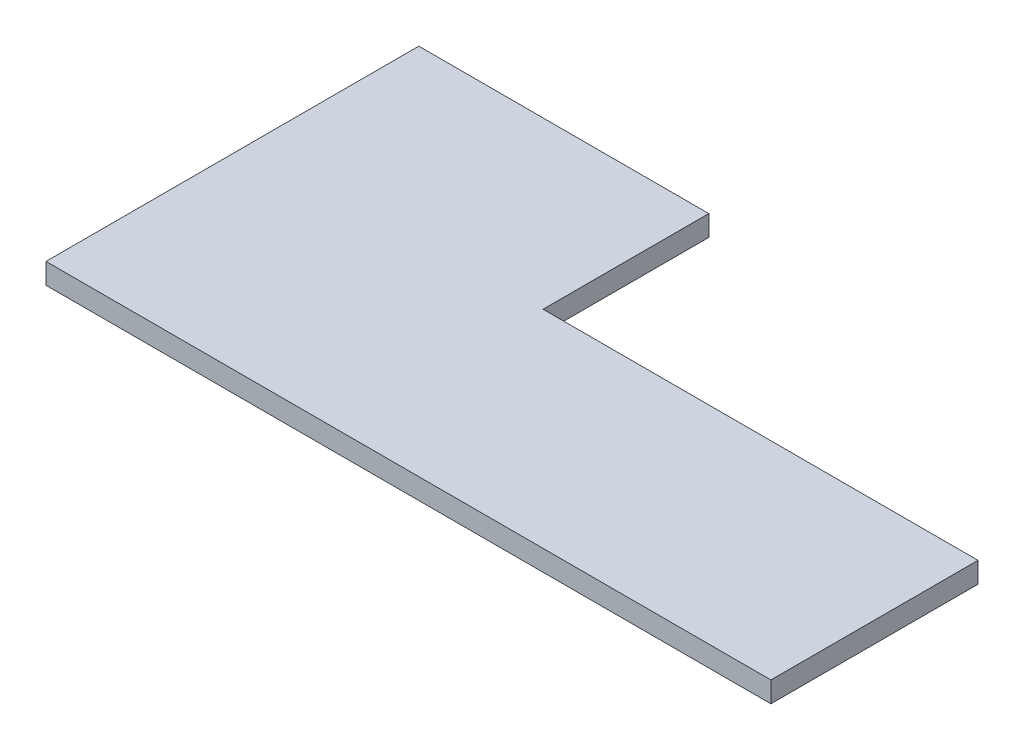
ISO-10303-21;
HEADER;
FILE_DESCRIPTION(('STEP AP214'),'2;1');
FILE_NAME('part.step','',(''),(''),'','','');
FILE_SCHEMA(('AUTOMOTIVE_DESIGN { 1 0 10303 214 1 1 1 1 }'));
ENDSEC;
DATA;
#1=APPLICATION_CONTEXT('core data for automotive mechanical design processes');
#2=APPLICATION_PROTOCOL_DEFINITION('international standard','automotive_design',2000,#1);
#3=PRODUCT_CONTEXT('',#1,'mechanical');
#4=PRODUCT('Part','Part','',(#3));
#5=PRODUCT_RELATED_PRODUCT_CATEGORY('part','',(#4));
#6=PRODUCT_DEFINITION_FORMATION('','',#4);
#7=PRODUCT_DEFINITION_CONTEXT('part definition',#1,'design');
#8=PRODUCT_DEFINITION('design','',#6,#7);
#9=PRODUCT_DEFINITION_SHAPE('','',#8);
#10=(LENGTH_UNIT() NAMED_UNIT(*) SI_UNIT(.MILLI.,.METRE.));
#11=(NAMED_UNIT(*) PLANE_ANGLE_UNIT() SI_UNIT($,.RADIAN.));
#12=(NAMED_UNIT(*) SI_UNIT($,.STERADIAN.) SOLID_ANGLE_UNIT());
#13=UNCERTAINTY_MEASURE_WITH_UNIT(LENGTH_MEASURE(1.E-05),#10,'distance_accuracy_value','');
#14=(GEOMETRIC_REPRESENTATION_CONTEXT(3) GLOBAL_UNCERTAINTY_ASSIGNED_CONTEXT((#13)) GLOBAL_UNIT_ASSIGNED_CONTEXT((#10,
#11,#12)) REPRESENTATION_CONTEXT('',''));
#15=CARTESIAN_POINT('',(0.,0.,0.));
#16=DIRECTION('',(0.,0.,1.));
#17=DIRECTION('',(1.,0.,0.));
#18=AXIS2_PLACEMENT_3D('',#15,#16,#17);
#19=CARTESIAN_POINT('',(14.,1.,0.));
#20=DIRECTION('',(1.,0.,0.));
#21=DIRECTION('',(0.,0.,-1.));
#22=AXIS2_PLACEMENT_3D('',#19,#20,#21);
#23=PLANE('',#22);
#24=DIRECTION('',(0.,0.,1.));
#25=VECTOR('',#24,1.);
#26=CARTESIAN_POINT('',(14.,0.,0.));
#27=LINE('',#26,#25);
#28=CARTESIAN_POINT('',(14.,0.,-18.));
#29=VERTEX_POINT('',#28);
#30=CARTESIAN_POINT('',(14.,0.,-10.));
#31=VERTEX_POINT('',#30);
#32=EDGE_CURVE('E125',#29,#31,#27,.T.);
#33=ORIENTED_EDGE('',*,*,#32,.F.);
#34=DIRECTION('',(0.,-1.,0.));
#35=VECTOR('',#34,1.);
#36=CARTESIAN_POINT('',(14.,1.,-18.));
#37=LINE('',#36,#35);
#38=CARTESIAN_POINT('',(14.,1.,-18.));
#39=VERTEX_POINT('',#38);
#40=EDGE_CURVE('E11',#39,#29,#37,.T.);
#41=ORIENTED_EDGE('',*,*,#40,.F.);
#42=DIRECTION('',(0.,0.,1.));
#43=VECTOR('',#42,1.);
#44=CARTESIAN_POINT('',(14.,1.,0.));
#45=LINE('',#44,#43);
#46=CARTESIAN_POINT('',(14.,1.,-10.));
#47=VERTEX_POINT('',#46);
#48=EDGE_CURVE('E143',#39,#47,#45,.T.);
#49=ORIENTED_EDGE('',*,*,#48,.T.);
#50=DIRECTION('',(0.,-1.,0.));
#51=VECTOR('',#50,1.);
#52=CARTESIAN_POINT('',(14.,1.,-10.));
#53=LINE('',#52,#51);
#54=EDGE_CURVE('E84',#47,#31,#53,.T.);
#55=ORIENTED_EDGE('',*,*,#54,.T.);
#56=EDGE_LOOP('',(#33,#41,#49,#55));
#57=FACE_BOUND('',#56,.T.);
#58=ADVANCED_FACE('F38',(#57),#23,.T.);
#59=CARTESIAN_POINT('',(0.,1.,-18.));
#60=DIRECTION('',(0.,0.,-1.));
#61=DIRECTION('',(-1.,0.,0.));
#62=AXIS2_PLACEMENT_3D('',#59,#60,#61);
#63=PLANE('',#62);
#64=DIRECTION('',(1.,0.,0.));
#65=VECTOR('',#64,1.);
#66=CARTESIAN_POINT('',(0.,0.,-18.));
#67=LINE('',#66,#65);
#68=CARTESIAN_POINT('',(0.,0.,-18.));
#69=VERTEX_POINT('',#68);
#70=EDGE_CURVE('E129',#69,#29,#67,.T.);
#71=ORIENTED_EDGE('',*,*,#70,.F.);
#72=DIRECTION('',(0.,-1.,0.));
#73=VECTOR('',#72,1.);
#74=CARTESIAN_POINT('',(0.,1.,-18.));
#75=LINE('',#74,#73);
#76=CARTESIAN_POINT('',(0.,1.,-18.));
#77=VERTEX_POINT('',#76);
#78=EDGE_CURVE('E47',#77,#69,#75,.T.);
#79=ORIENTED_EDGE('',*,*,#78,.F.);
#80=DIRECTION('',(1.,0.,0.));
#81=VECTOR('',#80,1.);
#82=CARTESIAN_POINT('',(0.,1.,-18.));
#83=LINE('',#82,#81);
#84=EDGE_CURVE('E162',#77,#39,#83,.T.);
#85=ORIENTED_EDGE('',*,*,#84,.T.);
#86=ORIENTED_EDGE('',*,*,#40,.T.);
#87=EDGE_LOOP('',(#71,#79,#85,#86));
#88=FACE_BOUND('',#87,.T.);
#89=ADVANCED_FACE('F155',(#88),#63,.T.);
#90=CARTESIAN_POINT('',(0.,1.,0.));
#91=DIRECTION('',(-1.,0.,0.));
#92=DIRECTION('',(0.,0.,1.));
#93=AXIS2_PLACEMENT_3D('',#90,#91,#92);
#94=PLANE('',#93);
#95=DIRECTION('',(0.,0.,-1.));
#96=VECTOR('',#95,1.);
#97=CARTESIAN_POINT('',(0.,0.,0.));
#98=LINE('',#97,#96);
#99=CARTESIAN_POINT('',(0.,0.,0.));
#100=VERTEX_POINT('',#99);
#101=EDGE_CURVE('E132',#100,#69,#98,.T.);
#102=ORIENTED_EDGE('',*,*,#101,.F.);
#103=DIRECTION('',(0.,-1.,0.));
#104=VECTOR('',#103,1.);
#105=CARTESIAN_POINT('',(0.,1.,0.));
#106=LINE('',#105,#104);
#107=CARTESIAN_POINT('',(0.,1.,0.));
#108=VERTEX_POINT('',#107);
#109=EDGE_CURVE('E113',#108,#100,#106,.T.);
#110=ORIENTED_EDGE('',*,*,#109,.F.);
#111=DIRECTION('',(0.,0.,-1.));
#112=VECTOR('',#111,1.);
#113=CARTESIAN_POINT('',(0.,1.,0.));
#114=LINE('',#113,#112);
#115=EDGE_CURVE('E104',#108,#77,#114,.T.);
#116=ORIENTED_EDGE('',*,*,#115,.T.);
#117=ORIENTED_EDGE('',*,*,#78,.T.);
#118=EDGE_LOOP('',(#102,#110,#116,#117));
#119=FACE_BOUND('',#118,.T.);
#120=ADVANCED_FACE('F152',(#119),#94,.T.);
#121=CARTESIAN_POINT('',(0.,1.,0.));
#122=DIRECTION('',(0.,0.,-1.));
#123=DIRECTION('',(-1.,0.,0.));
#124=AXIS2_PLACEMENT_3D('',#121,#122,#123);
#125=PLANE('',#124);
#126=DIRECTION('',(1.,0.,0.));
#127=VECTOR('',#126,1.);
#128=CARTESIAN_POINT('',(0.,0.,0.));
#129=LINE('',#128,#127);
#130=CARTESIAN_POINT('',(35.,0.,0.));
#131=VERTEX_POINT('',#130);
#132=EDGE_CURVE('E111',#100,#131,#129,.T.);
#133=ORIENTED_EDGE('',*,*,#132,.T.);
#134=DIRECTION('',(0.,-1.,0.));
#135=VECTOR('',#134,1.);
#136=CARTESIAN_POINT('',(35.,1.,0.));
#137=LINE('',#136,#135);
#138=CARTESIAN_POINT('',(35.,1.,0.));
#139=VERTEX_POINT('',#138);
#140=EDGE_CURVE('E108',#139,#131,#137,.T.);
#141=ORIENTED_EDGE('',*,*,#140,.F.);
#142=DIRECTION('',(1.,0.,0.));
#143=VECTOR('',#142,1.);
#144=CARTESIAN_POINT('',(0.,1.,0.));
#145=LINE('',#144,#143);
#146=EDGE_CURVE('E97',#108,#139,#145,.T.);
#147=ORIENTED_EDGE('',*,*,#146,.F.);
#148=ORIENTED_EDGE('',*,*,#109,.T.);
#149=EDGE_LOOP('',(#133,#141,#147,#148));
#150=FACE_BOUND('',#149,.T.);
#151=ADVANCED_FACE('F109',(#150),#125,.F.);
#152=CARTESIAN_POINT('',(35.,1.,0.));
#153=DIRECTION('',(-1.,0.,0.));
#154=DIRECTION('',(0.,0.,1.));
#155=AXIS2_PLACEMENT_3D('',#152,#153,#154);
#156=PLANE('',#155);
#157=DIRECTION('',(0.,0.,-1.));
#158=VECTOR('',#157,1.);
#159=CARTESIAN_POINT('',(35.,0.,0.));
#160=LINE('',#159,#158);
#161=CARTESIAN_POINT('',(35.,0.,-10.));
#162=VERTEX_POINT('',#161);
#163=EDGE_CURVE('E77',#131,#162,#160,.T.);
#164=ORIENTED_EDGE('',*,*,#163,.T.);
#165=DIRECTION('',(0.,-1.,0.));
#166=VECTOR('',#165,1.);
#167=CARTESIAN_POINT('',(35.,1.,-10.));
#168=LINE('',#167,#166);
#169=CARTESIAN_POINT('',(35.,1.,-10.));
#170=VERTEX_POINT('',#169);
#171=EDGE_CURVE('E114',#170,#162,#168,.T.);
#172=ORIENTED_EDGE('',*,*,#171,.F.);
#173=DIRECTION('',(0.,0.,-1.));
#174=VECTOR('',#173,1.);
#175=CARTESIAN_POINT('',(35.,1.,0.));
#176=LINE('',#175,#174);
#177=EDGE_CURVE('E101',#139,#170,#176,.T.);
#178=ORIENTED_EDGE('',*,*,#177,.F.);
#179=ORIENTED_EDGE('',*,*,#140,.T.);
#180=EDGE_LOOP('',(#164,#172,#178,#179));
#181=FACE_BOUND('',#180,.T.);
#182=ADVANCED_FACE('F116',(#181),#156,.F.);
#183=CARTESIAN_POINT('',(0.,1.,-10.));
#184=DIRECTION('',(0.,0.,1.));
#185=DIRECTION('',(1.,0.,0.));
#186=AXIS2_PLACEMENT_3D('',#183,#184,#185);
#187=PLANE('',#186);
#188=DIRECTION('',(-1.,0.,0.));
#189=VECTOR('',#188,1.);
#190=CARTESIAN_POINT('',(0.,0.,-10.));
#191=LINE('',#190,#189);
#192=EDGE_CURVE('E140',#162,#31,#191,.T.);
#193=ORIENTED_EDGE('',*,*,#192,.T.);
#194=ORIENTED_EDGE('',*,*,#54,.F.);
#195=DIRECTION('',(-1.,0.,0.));
#196=VECTOR('',#195,1.);
#197=CARTESIAN_POINT('',(0.,1.,-10.));
#198=LINE('',#197,#196);
#199=EDGE_CURVE('E55',#170,#47,#198,.T.);
#200=ORIENTED_EDGE('',*,*,#199,.F.);
#201=ORIENTED_EDGE('',*,*,#171,.T.);
#202=EDGE_LOOP('',(#193,#194,#200,#201));
#203=FACE_BOUND('',#202,.T.);
#204=ADVANCED_FACE('F160',(#203),#187,.F.);
#205=CARTESIAN_POINT('',(0.,1.,0.));
#206=DIRECTION('',(0.,1.,0.));
#207=DIRECTION('',(0.,0.,1.));
#208=AXIS2_PLACEMENT_3D('',#205,#206,#207);
#209=PLANE('',#208);
#210=ORIENTED_EDGE('',*,*,#48,.F.);
#211=ORIENTED_EDGE('',*,*,#84,.F.);
#212=ORIENTED_EDGE('',*,*,#115,.F.);
#213=ORIENTED_EDGE('',*,*,#146,.T.);
#214=ORIENTED_EDGE('',*,*,#177,.T.);
#215=ORIENTED_EDGE('',*,*,#199,.T.);
#216=EDGE_LOOP('',(#210,#211,#212,#213,#214,#215));
#217=FACE_BOUND('',#216,.T.);
#218=ADVANCED_FACE('F99',(#217),#209,.T.);
#219=CARTESIAN_POINT('',(0.,0.,0.));
#220=DIRECTION('',(0.,1.,0.));
#221=DIRECTION('',(0.,0.,1.));
#222=AXIS2_PLACEMENT_3D('',#219,#220,#221);
#223=PLANE('',#222);
#224=ORIENTED_EDGE('',*,*,#32,.T.);
#225=ORIENTED_EDGE('',*,*,#192,.F.);
#226=ORIENTED_EDGE('',*,*,#163,.F.);
#227=ORIENTED_EDGE('',*,*,#132,.F.);
#228=ORIENTED_EDGE('',*,*,#101,.T.);
#229=ORIENTED_EDGE('',*,*,#70,.T.);
#230=EDGE_LOOP('',(#224,#225,#226,#227,#228,#229));
#231=FACE_BOUND('',#230,.T.);
#232=ADVANCED_FACE('F157',(#231),#223,.F.);
#233=CLOSED_SHELL('',(#58,#89,#120,#151,#182,#204,#218,#232));
#234=MANIFOLD_SOLID_BREP('B2',#233);
#235=ADVANCED_BREP_SHAPE_REPRESENTATION('',(#18,#234),#14);
#236=SHAPE_DEFINITION_REPRESENTATION(#9,#235);
ENDSEC;
END-ISO-10303-21;
